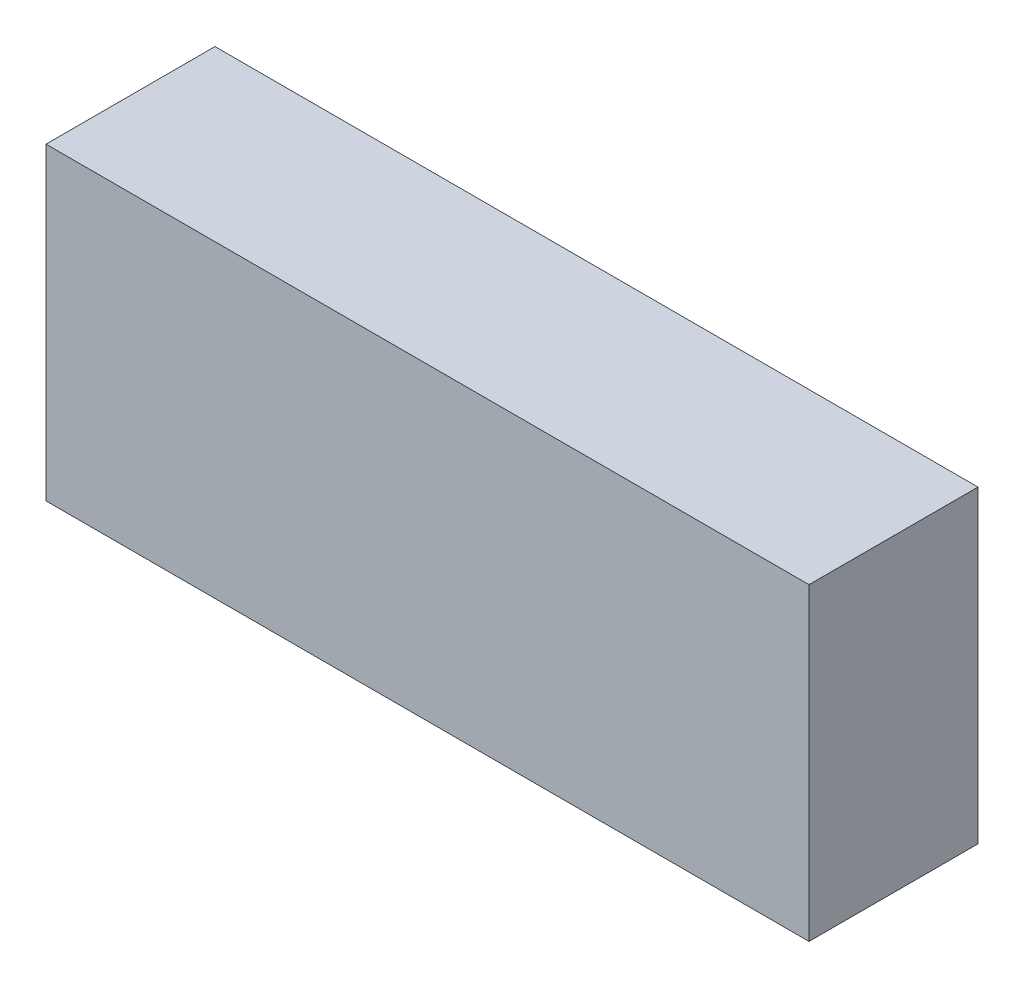
ISO-10303-21;
HEADER;
FILE_DESCRIPTION(('STEP AP214'),'2;1');
FILE_NAME('part.step','',(''),(''),'','','');
FILE_SCHEMA(('AUTOMOTIVE_DESIGN { 1 0 10303 214 1 1 1 1 }'));
ENDSEC;
DATA;
#1=APPLICATION_CONTEXT('core data for automotive mechanical design processes');
#2=APPLICATION_PROTOCOL_DEFINITION('international standard','automotive_design',2000,#1);
#3=PRODUCT_CONTEXT('',#1,'mechanical');
#4=PRODUCT('Part','Part','',(#3));
#5=PRODUCT_RELATED_PRODUCT_CATEGORY('part','',(#4));
#6=PRODUCT_DEFINITION_FORMATION('','',#4);
#7=PRODUCT_DEFINITION_CONTEXT('part definition',#1,'design');
#8=PRODUCT_DEFINITION('design','',#6,#7);
#9=PRODUCT_DEFINITION_SHAPE('','',#8);
#10=(LENGTH_UNIT() NAMED_UNIT(*) SI_UNIT(.MILLI.,.METRE.));
#11=(NAMED_UNIT(*) PLANE_ANGLE_UNIT() SI_UNIT($,.RADIAN.));
#12=(NAMED_UNIT(*) SI_UNIT($,.STERADIAN.) SOLID_ANGLE_UNIT());
#13=UNCERTAINTY_MEASURE_WITH_UNIT(LENGTH_MEASURE(1.E-05),#10,'distance_accuracy_value','');
#14=(GEOMETRIC_REPRESENTATION_CONTEXT(3) GLOBAL_UNCERTAINTY_ASSIGNED_CONTEXT((#13)) GLOBAL_UNIT_ASSIGNED_CONTEXT((#10,
#11,#12)) REPRESENTATION_CONTEXT('',''));
#15=CARTESIAN_POINT('',(0.,0.,0.));
#16=DIRECTION('',(0.,0.,1.));
#17=DIRECTION('',(1.,0.,0.));
#18=AXIS2_PLACEMENT_3D('',#15,#16,#17);
#19=CARTESIAN_POINT('',(12.1,-4.9,5.36));
#20=DIRECTION('',(-1.,0.,0.));
#21=DIRECTION('',(0.,0.,1.));
#22=AXIS2_PLACEMENT_3D('',#19,#20,#21);
#23=PLANE('',#22);
#24=DIRECTION('',(0.,1.,0.));
#25=VECTOR('',#24,1.);
#26=CARTESIAN_POINT('',(12.1,-4.9,0.));
#27=LINE('',#26,#25);
#28=CARTESIAN_POINT('',(12.1,-4.9,0.));
#29=VERTEX_POINT('',#28);
#30=CARTESIAN_POINT('',(12.1,4.9,0.));
#31=VERTEX_POINT('',#30);
#32=EDGE_CURVE('E96',#29,#31,#27,.T.);
#33=ORIENTED_EDGE('',*,*,#32,.T.);
#34=DIRECTION('',(0.,0.,-1.));
#35=VECTOR('',#34,1.);
#36=CARTESIAN_POINT('',(12.1,4.9,5.36));
#37=LINE('',#36,#35);
#38=CARTESIAN_POINT('',(12.1,4.9,5.36));
#39=VERTEX_POINT('',#38);
#40=EDGE_CURVE('E11',#39,#31,#37,.T.);
#41=ORIENTED_EDGE('',*,*,#40,.F.);
#42=DIRECTION('',(0.,1.,0.));
#43=VECTOR('',#42,1.);
#44=CARTESIAN_POINT('',(12.1,-4.9,5.36));
#45=LINE('',#44,#43);
#46=CARTESIAN_POINT('',(12.1,-4.9,5.36));
#47=VERTEX_POINT('',#46);
#48=EDGE_CURVE('E84',#47,#39,#45,.T.);
#49=ORIENTED_EDGE('',*,*,#48,.F.);
#50=DIRECTION('',(0.,0.,-1.));
#51=VECTOR('',#50,1.);
#52=CARTESIAN_POINT('',(12.1,-4.9,5.36));
#53=LINE('',#52,#51);
#54=EDGE_CURVE('E92',#47,#29,#53,.T.);
#55=ORIENTED_EDGE('',*,*,#54,.T.);
#56=EDGE_LOOP('',(#33,#41,#49,#55));
#57=FACE_BOUND('',#56,.T.);
#58=ADVANCED_FACE('F33',(#57),#23,.F.);
#59=CARTESIAN_POINT('',(-12.1,4.9,5.36));
#60=DIRECTION('',(0.,-1.,0.));
#61=DIRECTION('',(0.,0.,-1.));
#62=AXIS2_PLACEMENT_3D('',#59,#60,#61);
#63=PLANE('',#62);
#64=DIRECTION('',(-1.,0.,0.));
#65=VECTOR('',#64,1.);
#66=CARTESIAN_POINT('',(-12.1,4.9,0.));
#67=LINE('',#66,#65);
#68=CARTESIAN_POINT('',(-12.1,4.9,0.));
#69=VERTEX_POINT('',#68);
#70=EDGE_CURVE('E88',#31,#69,#67,.T.);
#71=ORIENTED_EDGE('',*,*,#70,.T.);
#72=DIRECTION('',(0.,0.,-1.));
#73=VECTOR('',#72,1.);
#74=CARTESIAN_POINT('',(-12.1,4.9,5.36));
#75=LINE('',#74,#73);
#76=CARTESIAN_POINT('',(-12.1,4.9,5.36));
#77=VERTEX_POINT('',#76);
#78=EDGE_CURVE('E41',#77,#69,#75,.T.);
#79=ORIENTED_EDGE('',*,*,#78,.F.);
#80=DIRECTION('',(-1.,0.,0.));
#81=VECTOR('',#80,1.);
#82=CARTESIAN_POINT('',(-12.1,4.9,5.36));
#83=LINE('',#82,#81);
#84=EDGE_CURVE('E79',#39,#77,#83,.T.);
#85=ORIENTED_EDGE('',*,*,#84,.F.);
#86=ORIENTED_EDGE('',*,*,#40,.T.);
#87=EDGE_LOOP('',(#71,#79,#85,#86));
#88=FACE_BOUND('',#87,.T.);
#89=ADVANCED_FACE('F87',(#88),#63,.F.);
#90=CARTESIAN_POINT('',(-12.1,-4.9,5.36));
#91=DIRECTION('',(1.,0.,0.));
#92=DIRECTION('',(0.,0.,-1.));
#93=AXIS2_PLACEMENT_3D('',#90,#91,#92);
#94=PLANE('',#93);
#95=DIRECTION('',(0.,-1.,0.));
#96=VECTOR('',#95,1.);
#97=CARTESIAN_POINT('',(-12.1,-4.9,0.));
#98=LINE('',#97,#96);
#99=CARTESIAN_POINT('',(-12.1,-4.9,0.));
#100=VERTEX_POINT('',#99);
#101=EDGE_CURVE('E66',#69,#100,#98,.T.);
#102=ORIENTED_EDGE('',*,*,#101,.T.);
#103=DIRECTION('',(0.,0.,-1.));
#104=VECTOR('',#103,1.);
#105=CARTESIAN_POINT('',(-12.1,-4.9,5.36));
#106=LINE('',#105,#104);
#107=CARTESIAN_POINT('',(-12.1,-4.9,5.36));
#108=VERTEX_POINT('',#107);
#109=EDGE_CURVE('E89',#108,#100,#106,.T.);
#110=ORIENTED_EDGE('',*,*,#109,.F.);
#111=DIRECTION('',(0.,-1.,0.));
#112=VECTOR('',#111,1.);
#113=CARTESIAN_POINT('',(-12.1,-4.9,5.36));
#114=LINE('',#113,#112);
#115=EDGE_CURVE('E82',#77,#108,#114,.T.);
#116=ORIENTED_EDGE('',*,*,#115,.F.);
#117=ORIENTED_EDGE('',*,*,#78,.T.);
#118=EDGE_LOOP('',(#102,#110,#116,#117));
#119=FACE_BOUND('',#118,.T.);
#120=ADVANCED_FACE('F90',(#119),#94,.F.);
#121=CARTESIAN_POINT('',(-12.1,-4.9,5.36));
#122=DIRECTION('',(0.,1.,0.));
#123=DIRECTION('',(0.,0.,1.));
#124=AXIS2_PLACEMENT_3D('',#121,#122,#123);
#125=PLANE('',#124);
#126=DIRECTION('',(1.,0.,0.));
#127=VECTOR('',#126,1.);
#128=CARTESIAN_POINT('',(-12.1,-4.9,0.));
#129=LINE('',#128,#127);
#130=EDGE_CURVE('E72',#100,#29,#129,.T.);
#131=ORIENTED_EDGE('',*,*,#130,.T.);
#132=ORIENTED_EDGE('',*,*,#54,.F.);
#133=DIRECTION('',(1.,0.,0.));
#134=VECTOR('',#133,1.);
#135=CARTESIAN_POINT('',(-12.1,-4.9,5.36));
#136=LINE('',#135,#134);
#137=EDGE_CURVE('E49',#108,#47,#136,.T.);
#138=ORIENTED_EDGE('',*,*,#137,.F.);
#139=ORIENTED_EDGE('',*,*,#109,.T.);
#140=EDGE_LOOP('',(#131,#132,#138,#139));
#141=FACE_BOUND('',#140,.T.);
#142=ADVANCED_FACE('F103',(#141),#125,.F.);
#143=CARTESIAN_POINT('',(0.,0.,5.36));
#144=DIRECTION('',(0.,0.,-1.));
#145=DIRECTION('',(-1.,0.,0.));
#146=AXIS2_PLACEMENT_3D('',#143,#144,#145);
#147=PLANE('',#146);
#148=ORIENTED_EDGE('',*,*,#48,.T.);
#149=ORIENTED_EDGE('',*,*,#84,.T.);
#150=ORIENTED_EDGE('',*,*,#115,.T.);
#151=ORIENTED_EDGE('',*,*,#137,.T.);
#152=EDGE_LOOP('',(#148,#149,#150,#151));
#153=FACE_BOUND('',#152,.T.);
#154=ADVANCED_FACE('F80',(#153),#147,.F.);
#155=CARTESIAN_POINT('',(0.,0.,0.));
#156=DIRECTION('',(0.,0.,-1.));
#157=DIRECTION('',(-1.,0.,0.));
#158=AXIS2_PLACEMENT_3D('',#155,#156,#157);
#159=PLANE('',#158);
#160=ORIENTED_EDGE('',*,*,#32,.F.);
#161=ORIENTED_EDGE('',*,*,#130,.F.);
#162=ORIENTED_EDGE('',*,*,#101,.F.);
#163=ORIENTED_EDGE('',*,*,#70,.F.);
#164=EDGE_LOOP('',(#160,#161,#162,#163));
#165=FACE_BOUND('',#164,.T.);
#166=ADVANCED_FACE('F106',(#165),#159,.T.);
#167=CLOSED_SHELL('',(#58,#89,#120,#142,#154,#166));
#168=MANIFOLD_SOLID_BREP('B2',#167);
#169=ADVANCED_BREP_SHAPE_REPRESENTATION('',(#18,#168),#14);
#170=SHAPE_DEFINITION_REPRESENTATION(#9,#169);
ENDSEC;
END-ISO-10303-21;
